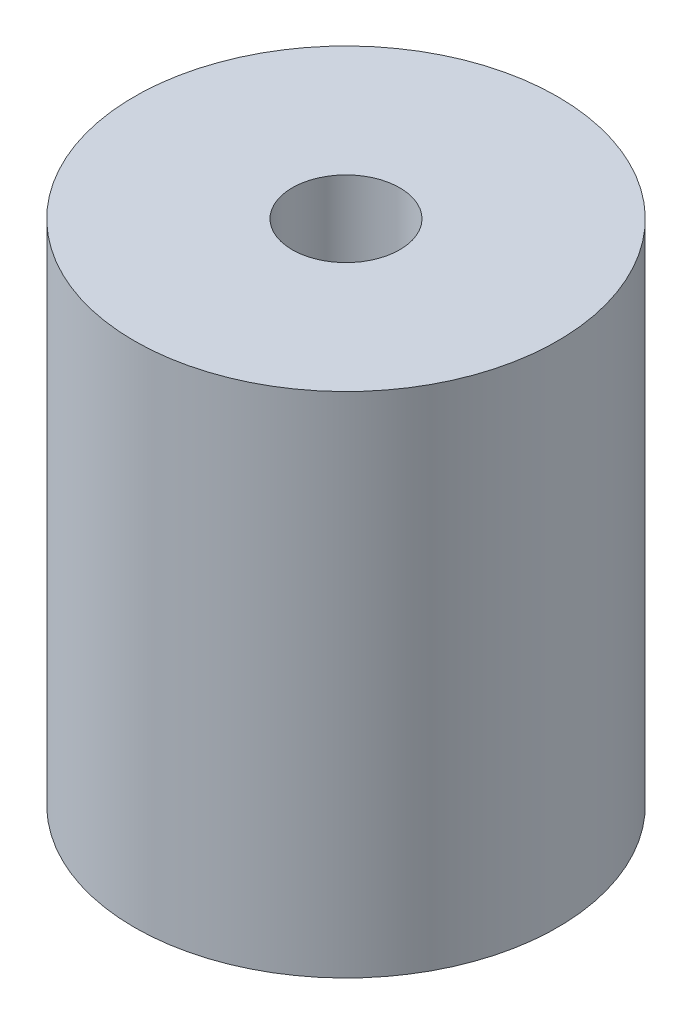
ISO-10303-21;
HEADER;
FILE_DESCRIPTION(('STEP AP214'),'2;1');
FILE_NAME('part.step','',(''),(''),'','','');
FILE_SCHEMA(('AUTOMOTIVE_DESIGN { 1 0 10303 214 1 1 1 1 }'));
ENDSEC;
DATA;
#1=APPLICATION_CONTEXT('core data for automotive mechanical design processes');
#2=APPLICATION_PROTOCOL_DEFINITION('international standard','automotive_design',2000,#1);
#3=PRODUCT_CONTEXT('',#1,'mechanical');
#4=PRODUCT('Part','Part','',(#3));
#5=PRODUCT_RELATED_PRODUCT_CATEGORY('part','',(#4));
#6=PRODUCT_DEFINITION_FORMATION('','',#4);
#7=PRODUCT_DEFINITION_CONTEXT('part definition',#1,'design');
#8=PRODUCT_DEFINITION('design','',#6,#7);
#9=PRODUCT_DEFINITION_SHAPE('','',#8);
#10=(LENGTH_UNIT() NAMED_UNIT(*) SI_UNIT(.MILLI.,.METRE.));
#11=(NAMED_UNIT(*) PLANE_ANGLE_UNIT() SI_UNIT($,.RADIAN.));
#12=(NAMED_UNIT(*) SI_UNIT($,.STERADIAN.) SOLID_ANGLE_UNIT());
#13=UNCERTAINTY_MEASURE_WITH_UNIT(LENGTH_MEASURE(1.E-05),#10,'distance_accuracy_value','');
#14=(GEOMETRIC_REPRESENTATION_CONTEXT(3) GLOBAL_UNCERTAINTY_ASSIGNED_CONTEXT((#13)) GLOBAL_UNIT_ASSIGNED_CONTEXT((#10,
#11,#12)) REPRESENTATION_CONTEXT('',''));
#15=CARTESIAN_POINT('',(0.,0.,0.));
#16=DIRECTION('',(0.,0.,1.));
#17=DIRECTION('',(1.,0.,0.));
#18=AXIS2_PLACEMENT_3D('',#15,#16,#17);
#19=CARTESIAN_POINT('',(0.,30.,0.));
#20=DIRECTION('',(0.,-1.,0.));
#21=DIRECTION('',(0.,0.,-1.));
#22=AXIS2_PLACEMENT_3D('',#19,#20,#21);
#23=CYLINDRICAL_SURFACE('',#22,12.5);
#24=CARTESIAN_POINT('',(0.,30.,0.));
#25=DIRECTION('',(0.,1.,0.));
#26=DIRECTION('',(0.,0.,1.));
#27=AXIS2_PLACEMENT_3D('',#24,#25,#26);
#28=CIRCLE('',#27,12.5);
#29=CARTESIAN_POINT('',(0.,30.,12.5));
#30=VERTEX_POINT('',#29);
#31=EDGE_CURVE('E10',#30,#30,#28,.T.);
#32=ORIENTED_EDGE('',*,*,#31,.F.);
#33=EDGE_LOOP('',(#32));
#34=FACE_BOUND('',#33,.T.);
#35=CARTESIAN_POINT('',(0.,0.,0.));
#36=DIRECTION('',(0.,1.,0.));
#37=DIRECTION('',(0.,0.,1.));
#38=AXIS2_PLACEMENT_3D('',#35,#36,#37);
#39=CIRCLE('',#38,12.5);
#40=CARTESIAN_POINT('',(0.,0.,12.5));
#41=VERTEX_POINT('',#40);
#42=EDGE_CURVE('E33',#41,#41,#39,.T.);
#43=ORIENTED_EDGE('',*,*,#42,.T.);
#44=EDGE_LOOP('',(#43));
#45=FACE_BOUND('',#44,.T.);
#46=ADVANCED_FACE('F30',(#34,#45),#23,.T.);
#47=CARTESIAN_POINT('',(0.,30.,0.));
#48=DIRECTION('',(0.,1.,0.));
#49=DIRECTION('',(0.,0.,1.));
#50=AXIS2_PLACEMENT_3D('',#47,#48,#49);
#51=PLANE('',#50);
#52=CARTESIAN_POINT('',(0.,30.,0.));
#53=DIRECTION('',(0.,1.,0.));
#54=DIRECTION('',(0.,0.,1.));
#55=AXIS2_PLACEMENT_3D('',#52,#53,#54);
#56=CIRCLE('',#55,3.175);
#57=CARTESIAN_POINT('',(0.,30.,3.175));
#58=VERTEX_POINT('',#57);
#59=EDGE_CURVE('E42',#58,#58,#56,.T.);
#60=ORIENTED_EDGE('',*,*,#59,.F.);
#61=EDGE_LOOP('',(#60));
#62=FACE_BOUND('',#61,.T.);
#63=ORIENTED_EDGE('',*,*,#31,.T.);
#64=EDGE_LOOP('',(#63));
#65=FACE_BOUND('',#64,.T.);
#66=ADVANCED_FACE('F67',(#62,#65),#51,.T.);
#67=CARTESIAN_POINT('',(0.,0.,0.));
#68=DIRECTION('',(0.,1.,0.));
#69=DIRECTION('',(0.,0.,1.));
#70=AXIS2_PLACEMENT_3D('',#67,#68,#69);
#71=PLANE('',#70);
#72=CARTESIAN_POINT('',(0.,0.,0.));
#73=DIRECTION('',(0.,-1.,0.));
#74=DIRECTION('',(0.,0.,-1.));
#75=AXIS2_PLACEMENT_3D('',#72,#73,#74);
#76=CIRCLE('',#75,4.);
#77=CARTESIAN_POINT('',(0.,0.,-4.));
#78=VERTEX_POINT('',#77);
#79=EDGE_CURVE('E48',#78,#78,#76,.T.);
#80=ORIENTED_EDGE('',*,*,#79,.F.);
#81=EDGE_LOOP('',(#80));
#82=FACE_BOUND('',#81,.T.);
#83=ORIENTED_EDGE('',*,*,#42,.F.);
#84=EDGE_LOOP('',(#83));
#85=FACE_BOUND('',#84,.T.);
#86=ADVANCED_FACE('F63',(#82,#85),#71,.F.);
#87=CARTESIAN_POINT('',(0.,18.,0.));
#88=DIRECTION('',(0.,1.,0.));
#89=DIRECTION('',(0.,0.,1.));
#90=AXIS2_PLACEMENT_3D('',#87,#88,#89);
#91=CYLINDRICAL_SURFACE('',#90,3.175);
#92=CARTESIAN_POINT('',(0.,18.,0.));
#93=DIRECTION('',(0.,1.,0.));
#94=DIRECTION('',(0.,0.,1.));
#95=AXIS2_PLACEMENT_3D('',#92,#93,#94);
#96=CIRCLE('',#95,3.175);
#97=CARTESIAN_POINT('',(0.,18.,3.175));
#98=VERTEX_POINT('',#97);
#99=EDGE_CURVE('E40',#98,#98,#96,.T.);
#100=ORIENTED_EDGE('',*,*,#99,.F.);
#101=EDGE_LOOP('',(#100));
#102=FACE_BOUND('',#101,.T.);
#103=ORIENTED_EDGE('',*,*,#59,.T.);
#104=EDGE_LOOP('',(#103));
#105=FACE_BOUND('',#104,.T.);
#106=ADVANCED_FACE('F66',(#102,#105),#91,.F.);
#107=CARTESIAN_POINT('',(0.,18.,0.));
#108=DIRECTION('',(0.,1.,0.));
#109=DIRECTION('',(0.,0.,1.));
#110=AXIS2_PLACEMENT_3D('',#107,#108,#109);
#111=PLANE('',#110);
#112=ORIENTED_EDGE('',*,*,#99,.T.);
#113=EDGE_LOOP('',(#112));
#114=FACE_BOUND('',#113,.T.);
#115=ADVANCED_FACE('F59',(#114),#111,.T.);
#116=CARTESIAN_POINT('',(0.,12.,0.));
#117=DIRECTION('',(0.,-1.,0.));
#118=DIRECTION('',(0.,0.,-1.));
#119=AXIS2_PLACEMENT_3D('',#116,#117,#118);
#120=CYLINDRICAL_SURFACE('',#119,4.);
#121=CARTESIAN_POINT('',(0.,12.,0.));
#122=DIRECTION('',(0.,-1.,0.));
#123=DIRECTION('',(0.,0.,-1.));
#124=AXIS2_PLACEMENT_3D('',#121,#122,#123);
#125=CIRCLE('',#124,4.);
#126=CARTESIAN_POINT('',(0.,12.,-4.));
#127=VERTEX_POINT('',#126);
#128=EDGE_CURVE('E45',#127,#127,#125,.T.);
#129=ORIENTED_EDGE('',*,*,#128,.F.);
#130=EDGE_LOOP('',(#129));
#131=FACE_BOUND('',#130,.T.);
#132=ORIENTED_EDGE('',*,*,#79,.T.);
#133=EDGE_LOOP('',(#132));
#134=FACE_BOUND('',#133,.T.);
#135=ADVANCED_FACE('F56',(#131,#134),#120,.F.);
#136=CARTESIAN_POINT('',(0.,12.,0.));
#137=DIRECTION('',(0.,-1.,0.));
#138=DIRECTION('',(0.,0.,-1.));
#139=AXIS2_PLACEMENT_3D('',#136,#137,#138);
#140=PLANE('',#139);
#141=ORIENTED_EDGE('',*,*,#128,.T.);
#142=EDGE_LOOP('',(#141));
#143=FACE_BOUND('',#142,.T.);
#144=ADVANCED_FACE('F54',(#143),#140,.T.);
#145=CLOSED_SHELL('',(#46,#66,#86,#106,#115,#135,#144));
#146=MANIFOLD_SOLID_BREP('B2',#145);
#147=ADVANCED_BREP_SHAPE_REPRESENTATION('',(#18,#146),#14);
#148=SHAPE_DEFINITION_REPRESENTATION(#9,#147);
ENDSEC;
END-ISO-10303-21;
